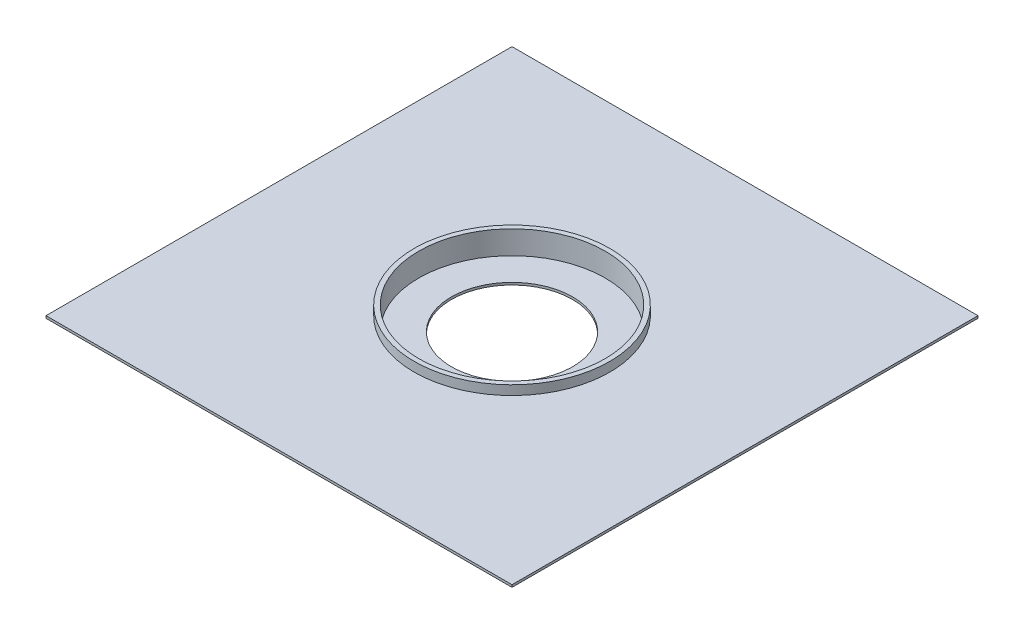
ISO-10303-21;
HEADER;
FILE_DESCRIPTION(('STEP AP214'),'2;1');
FILE_NAME('part.step','',(''),(''),'','','');
FILE_SCHEMA(('AUTOMOTIVE_DESIGN { 1 0 10303 214 1 1 1 1 }'));
ENDSEC;
DATA;
#1=APPLICATION_CONTEXT('core data for automotive mechanical design processes');
#2=APPLICATION_PROTOCOL_DEFINITION('international standard','automotive_design',2000,#1);
#3=PRODUCT_CONTEXT('',#1,'mechanical');
#4=PRODUCT('Part','Part','',(#3));
#5=PRODUCT_RELATED_PRODUCT_CATEGORY('part','',(#4));
#6=PRODUCT_DEFINITION_FORMATION('','',#4);
#7=PRODUCT_DEFINITION_CONTEXT('part definition',#1,'design');
#8=PRODUCT_DEFINITION('design','',#6,#7);
#9=PRODUCT_DEFINITION_SHAPE('','',#8);
#10=(LENGTH_UNIT() NAMED_UNIT(*) SI_UNIT(.MILLI.,.METRE.));
#11=(NAMED_UNIT(*) PLANE_ANGLE_UNIT() SI_UNIT($,.RADIAN.));
#12=(NAMED_UNIT(*) SI_UNIT($,.STERADIAN.) SOLID_ANGLE_UNIT());
#13=UNCERTAINTY_MEASURE_WITH_UNIT(LENGTH_MEASURE(1.E-05),#10,'distance_accuracy_value','');
#14=(GEOMETRIC_REPRESENTATION_CONTEXT(3) GLOBAL_UNCERTAINTY_ASSIGNED_CONTEXT((#13)) GLOBAL_UNIT_ASSIGNED_CONTEXT((#10,
#11,#12)) REPRESENTATION_CONTEXT('',''));
#15=CARTESIAN_POINT('',(0.,0.,0.));
#16=DIRECTION('',(0.,0.,1.));
#17=DIRECTION('',(1.,0.,0.));
#18=AXIS2_PLACEMENT_3D('',#15,#16,#17);
#19=CARTESIAN_POINT('',(0.,1.,0.));
#20=DIRECTION('',(1.,0.,0.));
#21=DIRECTION('',(0.,0.,-1.));
#22=AXIS2_PLACEMENT_3D('',#19,#20,#21);
#23=PLANE('',#22);
#24=DIRECTION('',(0.,0.,1.));
#25=VECTOR('',#24,1.);
#26=CARTESIAN_POINT('',(0.,0.,0.));
#27=LINE('',#26,#25);
#28=CARTESIAN_POINT('',(0.,0.,0.));
#29=VERTEX_POINT('',#28);
#30=CARTESIAN_POINT('',(0.,0.,200.));
#31=VERTEX_POINT('',#30);
#32=EDGE_CURVE('E103',#29,#31,#27,.T.);
#33=ORIENTED_EDGE('',*,*,#32,.T.);
#34=DIRECTION('',(0.,-1.,0.));
#35=VECTOR('',#34,1.);
#36=CARTESIAN_POINT('',(0.,1.,200.));
#37=LINE('',#36,#35);
#38=CARTESIAN_POINT('',(0.,1.,200.));
#39=VERTEX_POINT('',#38);
#40=EDGE_CURVE('E44',#39,#31,#37,.T.);
#41=ORIENTED_EDGE('',*,*,#40,.F.);
#42=DIRECTION('',(0.,0.,1.));
#43=VECTOR('',#42,1.);
#44=CARTESIAN_POINT('',(0.,1.,0.));
#45=LINE('',#44,#43);
#46=CARTESIAN_POINT('',(0.,1.,0.));
#47=VERTEX_POINT('',#46);
#48=EDGE_CURVE('E89',#47,#39,#45,.T.);
#49=ORIENTED_EDGE('',*,*,#48,.F.);
#50=DIRECTION('',(0.,-1.,0.));
#51=VECTOR('',#50,1.);
#52=CARTESIAN_POINT('',(0.,1.,0.));
#53=LINE('',#52,#51);
#54=EDGE_CURVE('E99',#47,#29,#53,.T.);
#55=ORIENTED_EDGE('',*,*,#54,.T.);
#56=EDGE_LOOP('',(#33,#41,#49,#55));
#57=FACE_BOUND('',#56,.T.);
#58=ADVANCED_FACE('F35',(#57),#23,.F.);
#59=CARTESIAN_POINT('',(0.,1.,200.));
#60=DIRECTION('',(0.,0.,-1.));
#61=DIRECTION('',(-1.,0.,0.));
#62=AXIS2_PLACEMENT_3D('',#59,#60,#61);
#63=PLANE('',#62);
#64=DIRECTION('',(1.,0.,0.));
#65=VECTOR('',#64,1.);
#66=CARTESIAN_POINT('',(0.,0.,200.));
#67=LINE('',#66,#65);
#68=CARTESIAN_POINT('',(200.,0.,200.));
#69=VERTEX_POINT('',#68);
#70=EDGE_CURVE('E94',#31,#69,#67,.T.);
#71=ORIENTED_EDGE('',*,*,#70,.T.);
#72=DIRECTION('',(0.,-1.,0.));
#73=VECTOR('',#72,1.);
#74=CARTESIAN_POINT('',(200.,1.,200.));
#75=LINE('',#74,#73);
#76=CARTESIAN_POINT('',(200.,1.,200.));
#77=VERTEX_POINT('',#76);
#78=EDGE_CURVE('E92',#77,#69,#75,.T.);
#79=ORIENTED_EDGE('',*,*,#78,.F.);
#80=DIRECTION('',(1.,0.,0.));
#81=VECTOR('',#80,1.);
#82=CARTESIAN_POINT('',(0.,1.,200.));
#83=LINE('',#82,#81);
#84=EDGE_CURVE('E84',#39,#77,#83,.T.);
#85=ORIENTED_EDGE('',*,*,#84,.F.);
#86=ORIENTED_EDGE('',*,*,#40,.T.);
#87=EDGE_LOOP('',(#71,#79,#85,#86));
#88=FACE_BOUND('',#87,.T.);
#89=ADVANCED_FACE('F93',(#88),#63,.F.);
#90=CARTESIAN_POINT('',(200.,1.,0.));
#91=DIRECTION('',(-1.,0.,0.));
#92=DIRECTION('',(0.,0.,1.));
#93=AXIS2_PLACEMENT_3D('',#90,#91,#92);
#94=PLANE('',#93);
#95=DIRECTION('',(0.,0.,-1.));
#96=VECTOR('',#95,1.);
#97=CARTESIAN_POINT('',(200.,0.,0.));
#98=LINE('',#97,#96);
#99=CARTESIAN_POINT('',(200.,0.,0.));
#100=VERTEX_POINT('',#99);
#101=EDGE_CURVE('E70',#69,#100,#98,.T.);
#102=ORIENTED_EDGE('',*,*,#101,.T.);
#103=DIRECTION('',(0.,-1.,0.));
#104=VECTOR('',#103,1.);
#105=CARTESIAN_POINT('',(200.,1.,0.));
#106=LINE('',#105,#104);
#107=CARTESIAN_POINT('',(200.,1.,0.));
#108=VERTEX_POINT('',#107);
#109=EDGE_CURVE('E95',#108,#100,#106,.T.);
#110=ORIENTED_EDGE('',*,*,#109,.F.);
#111=DIRECTION('',(0.,0.,-1.));
#112=VECTOR('',#111,1.);
#113=CARTESIAN_POINT('',(200.,1.,0.));
#114=LINE('',#113,#112);
#115=EDGE_CURVE('E87',#77,#108,#114,.T.);
#116=ORIENTED_EDGE('',*,*,#115,.F.);
#117=ORIENTED_EDGE('',*,*,#78,.T.);
#118=EDGE_LOOP('',(#102,#110,#116,#117));
#119=FACE_BOUND('',#118,.T.);
#120=ADVANCED_FACE('F97',(#119),#94,.F.);
#121=CARTESIAN_POINT('',(0.,1.,0.));
#122=DIRECTION('',(0.,0.,1.));
#123=DIRECTION('',(1.,0.,0.));
#124=AXIS2_PLACEMENT_3D('',#121,#122,#123);
#125=PLANE('',#124);
#126=DIRECTION('',(-1.,0.,0.));
#127=VECTOR('',#126,1.);
#128=CARTESIAN_POINT('',(0.,0.,0.));
#129=LINE('',#128,#127);
#130=EDGE_CURVE('E76',#100,#29,#129,.T.);
#131=ORIENTED_EDGE('',*,*,#130,.T.);
#132=ORIENTED_EDGE('',*,*,#54,.F.);
#133=DIRECTION('',(-1.,0.,0.));
#134=VECTOR('',#133,1.);
#135=CARTESIAN_POINT('',(0.,1.,0.));
#136=LINE('',#135,#134);
#137=EDGE_CURVE('E53',#108,#47,#136,.T.);
#138=ORIENTED_EDGE('',*,*,#137,.F.);
#139=ORIENTED_EDGE('',*,*,#109,.T.);
#140=EDGE_LOOP('',(#131,#132,#138,#139));
#141=FACE_BOUND('',#140,.T.);
#142=ADVANCED_FACE('F126',(#141),#125,.F.);
#143=CARTESIAN_POINT('',(0.,1.,0.));
#144=DIRECTION('',(0.,1.,0.));
#145=DIRECTION('',(0.,0.,1.));
#146=AXIS2_PLACEMENT_3D('',#143,#144,#145);
#147=PLANE('',#146);
#148=CARTESIAN_POINT('',(100.,1.,100.));
#149=DIRECTION('',(0.,1.,0.));
#150=DIRECTION('',(0.,0.,1.));
#151=AXIS2_PLACEMENT_3D('',#148,#149,#150);
#152=CIRCLE('',#151,42.);
#153=CARTESIAN_POINT('',(100.,1.,142.));
#154=VERTEX_POINT('',#153);
#155=EDGE_CURVE('E11',#154,#154,#152,.T.);
#156=ORIENTED_EDGE('',*,*,#155,.F.);
#157=EDGE_LOOP('',(#156));
#158=FACE_BOUND('',#157,.T.);
#159=ORIENTED_EDGE('',*,*,#48,.T.);
#160=ORIENTED_EDGE('',*,*,#84,.T.);
#161=ORIENTED_EDGE('',*,*,#115,.T.);
#162=ORIENTED_EDGE('',*,*,#137,.T.);
#163=EDGE_LOOP('',(#159,#160,#161,#162));
#164=FACE_BOUND('',#163,.T.);
#165=ADVANCED_FACE('F85',(#158,#164),#147,.T.);
#166=CARTESIAN_POINT('',(0.,0.,0.));
#167=DIRECTION('',(0.,1.,0.));
#168=DIRECTION('',(0.,0.,1.));
#169=AXIS2_PLACEMENT_3D('',#166,#167,#168);
#170=PLANE('',#169);
#171=CARTESIAN_POINT('',(100.,0.,100.));
#172=DIRECTION('',(0.,1.,0.));
#173=DIRECTION('',(0.,0.,1.));
#174=AXIS2_PLACEMENT_3D('',#171,#172,#173);
#175=CIRCLE('',#174,42.);
#176=CARTESIAN_POINT('',(100.,0.,142.));
#177=VERTEX_POINT('',#176);
#178=EDGE_CURVE('E38',#177,#177,#175,.T.);
#179=ORIENTED_EDGE('',*,*,#178,.T.);
#180=EDGE_LOOP('',(#179));
#181=FACE_BOUND('',#180,.T.);
#182=ORIENTED_EDGE('',*,*,#32,.F.);
#183=ORIENTED_EDGE('',*,*,#130,.F.);
#184=ORIENTED_EDGE('',*,*,#101,.F.);
#185=ORIENTED_EDGE('',*,*,#70,.F.);
#186=EDGE_LOOP('',(#182,#183,#184,#185));
#187=FACE_BOUND('',#186,.T.);
#188=ADVANCED_FACE('F113',(#181,#187),#170,.F.);
#189=CARTESIAN_POINT('',(100.,5.,100.));
#190=DIRECTION('',(0.,-1.,0.));
#191=DIRECTION('',(0.,0.,-1.));
#192=AXIS2_PLACEMENT_3D('',#189,#190,#191);
#193=CYLINDRICAL_SURFACE('',#192,42.);
#194=ORIENTED_EDGE('',*,*,#178,.F.);
#195=EDGE_LOOP('',(#194));
#196=FACE_BOUND('',#195,.T.);
#197=CARTESIAN_POINT('',(100.,-6.,100.));
#198=DIRECTION('',(0.,-1.,0.));
#199=DIRECTION('',(0.,0.,-1.));
#200=AXIS2_PLACEMENT_3D('',#197,#198,#199);
#201=CIRCLE('',#200,42.);
#202=CARTESIAN_POINT('',(100.,-6.,58.));
#203=VERTEX_POINT('',#202);
#204=EDGE_CURVE('E229',#203,#203,#201,.T.);
#205=ORIENTED_EDGE('',*,*,#204,.F.);
#206=EDGE_LOOP('',(#205));
#207=FACE_BOUND('',#206,.T.);
#208=ADVANCED_FACE('F115',(#196,#207),#193,.T.);
#209=CARTESIAN_POINT('',(100.,0.,100.));
#210=DIRECTION('',(0.,1.,0.));
#211=DIRECTION('',(0.,0.,1.));
#212=AXIS2_PLACEMENT_3D('',#209,#210,#211);
#213=CYLINDRICAL_SURFACE('',#212,40.);
#214=CARTESIAN_POINT('',(100.,-5.,100.));
#215=DIRECTION('',(0.,-1.,0.));
#216=DIRECTION('',(0.,0.,-1.));
#217=AXIS2_PLACEMENT_3D('',#214,#215,#216);
#218=CIRCLE('',#217,40.);
#219=CARTESIAN_POINT('',(100.,-5.,60.));
#220=VERTEX_POINT('',#219);
#221=EDGE_CURVE('E234',#220,#220,#218,.T.);
#222=ORIENTED_EDGE('',*,*,#221,.T.);
#223=EDGE_LOOP('',(#222));
#224=FACE_BOUND('',#223,.T.);
#225=CARTESIAN_POINT('',(100.,5.,100.));
#226=DIRECTION('',(0.,-1.,0.));
#227=DIRECTION('',(0.,0.,-1.));
#228=AXIS2_PLACEMENT_3D('',#225,#226,#227);
#229=CIRCLE('',#228,40.);
#230=CARTESIAN_POINT('',(100.,5.,60.));
#231=VERTEX_POINT('',#230);
#232=EDGE_CURVE('E237',#231,#231,#229,.T.);
#233=ORIENTED_EDGE('',*,*,#232,.F.);
#234=EDGE_LOOP('',(#233));
#235=FACE_BOUND('',#234,.T.);
#236=ADVANCED_FACE('F122',(#224,#235),#213,.F.);
#237=ORIENTED_EDGE('',*,*,#155,.T.);
#238=EDGE_LOOP('',(#237));
#239=FACE_BOUND('',#238,.T.);
#240=CARTESIAN_POINT('',(100.,5.,100.));
#241=DIRECTION('',(0.,-1.,0.));
#242=DIRECTION('',(0.,0.,-1.));
#243=AXIS2_PLACEMENT_3D('',#240,#241,#242);
#244=CIRCLE('',#243,42.);
#245=CARTESIAN_POINT('',(100.,5.,58.));
#246=VERTEX_POINT('',#245);
#247=EDGE_CURVE('E240',#246,#246,#244,.T.);
#248=ORIENTED_EDGE('',*,*,#247,.T.);
#249=EDGE_LOOP('',(#248));
#250=FACE_BOUND('',#249,.T.);
#251=ADVANCED_FACE('F125',(#239,#250),#193,.T.);
#252=CARTESIAN_POINT('',(100.,5.,100.));
#253=DIRECTION('',(0.,-1.,0.));
#254=DIRECTION('',(0.,0.,-1.));
#255=AXIS2_PLACEMENT_3D('',#252,#253,#254);
#256=PLANE('',#255);
#257=ORIENTED_EDGE('',*,*,#232,.T.);
#258=EDGE_LOOP('',(#257));
#259=FACE_BOUND('',#258,.T.);
#260=ORIENTED_EDGE('',*,*,#247,.F.);
#261=EDGE_LOOP('',(#260));
#262=FACE_BOUND('',#261,.T.);
#263=ADVANCED_FACE('F172',(#259,#262),#256,.F.);
#264=CARTESIAN_POINT('',(100.,-5.,100.));
#265=DIRECTION('',(0.,-1.,0.));
#266=DIRECTION('',(0.,0.,-1.));
#267=AXIS2_PLACEMENT_3D('',#264,#265,#266);
#268=PLANE('',#267);
#269=CARTESIAN_POINT('',(100.,-5.,100.));
#270=DIRECTION('',(0.,-1.,0.));
#271=DIRECTION('',(0.,0.,-1.));
#272=AXIS2_PLACEMENT_3D('',#269,#270,#271);
#273=CIRCLE('',#272,26.);
#274=CARTESIAN_POINT('',(100.,-5.,74.));
#275=VERTEX_POINT('',#274);
#276=EDGE_CURVE('E227',#275,#275,#273,.T.);
#277=ORIENTED_EDGE('',*,*,#276,.T.);
#278=EDGE_LOOP('',(#277));
#279=FACE_BOUND('',#278,.T.);
#280=ORIENTED_EDGE('',*,*,#221,.F.);
#281=EDGE_LOOP('',(#280));
#282=FACE_BOUND('',#281,.T.);
#283=ADVANCED_FACE('F181',(#279,#282),#268,.F.);
#284=CARTESIAN_POINT('',(100.,-6.,100.));
#285=DIRECTION('',(0.,-1.,0.));
#286=DIRECTION('',(0.,0.,-1.));
#287=AXIS2_PLACEMENT_3D('',#284,#285,#286);
#288=PLANE('',#287);
#289=ORIENTED_EDGE('',*,*,#204,.T.);
#290=EDGE_LOOP('',(#289));
#291=FACE_BOUND('',#290,.T.);
#292=CARTESIAN_POINT('',(100.,-6.,100.));
#293=DIRECTION('',(0.,-1.,0.));
#294=DIRECTION('',(0.,0.,-1.));
#295=AXIS2_PLACEMENT_3D('',#292,#293,#294);
#296=CIRCLE('',#295,26.);
#297=CARTESIAN_POINT('',(100.,-6.,74.));
#298=VERTEX_POINT('',#297);
#299=EDGE_CURVE('E224',#298,#298,#296,.T.);
#300=ORIENTED_EDGE('',*,*,#299,.F.);
#301=EDGE_LOOP('',(#300));
#302=FACE_BOUND('',#301,.T.);
#303=ADVANCED_FACE('F197',(#291,#302),#288,.T.);
#304=CARTESIAN_POINT('',(100.,-6.,100.));
#305=DIRECTION('',(0.,1.,0.));
#306=DIRECTION('',(0.,0.,1.));
#307=AXIS2_PLACEMENT_3D('',#304,#305,#306);
#308=CYLINDRICAL_SURFACE('',#307,26.);
#309=ORIENTED_EDGE('',*,*,#299,.T.);
#310=EDGE_LOOP('',(#309));
#311=FACE_BOUND('',#310,.T.);
#312=ORIENTED_EDGE('',*,*,#276,.F.);
#313=EDGE_LOOP('',(#312));
#314=FACE_BOUND('',#313,.T.);
#315=ADVANCED_FACE('F207',(#311,#314),#308,.F.);
#316=CLOSED_SHELL('',(#58,#89,#120,#142,#165,#188,#208,#236,#251,#263,#283,#303,#315));
#317=MANIFOLD_SOLID_BREP('B2',#316);
#318=ADVANCED_BREP_SHAPE_REPRESENTATION('',(#18,#317),#14);
#319=SHAPE_DEFINITION_REPRESENTATION(#9,#318);
ENDSEC;
END-ISO-10303-21;
